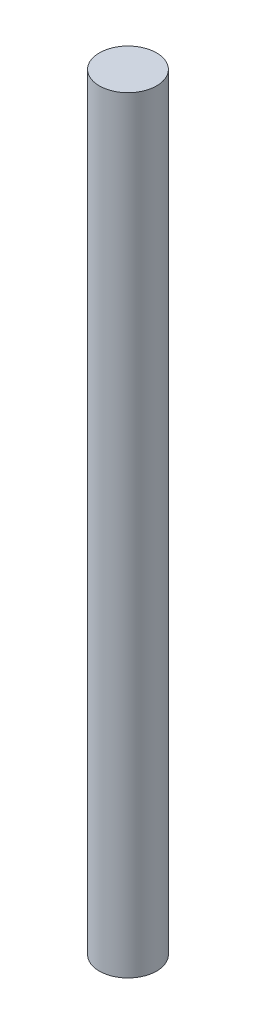
ISO-10303-21;
HEADER;
FILE_DESCRIPTION(('STEP AP214'),'2;1');
FILE_NAME('part.step','',(''),(''),'','','');
FILE_SCHEMA(('AUTOMOTIVE_DESIGN { 1 0 10303 214 1 1 1 1 }'));
ENDSEC;
DATA;
#1=APPLICATION_CONTEXT('core data for automotive mechanical design processes');
#2=APPLICATION_PROTOCOL_DEFINITION('international standard','automotive_design',2000,#1);
#3=PRODUCT_CONTEXT('',#1,'mechanical');
#4=PRODUCT('Part','Part','',(#3));
#5=PRODUCT_RELATED_PRODUCT_CATEGORY('part','',(#4));
#6=PRODUCT_DEFINITION_FORMATION('','',#4);
#7=PRODUCT_DEFINITION_CONTEXT('part definition',#1,'design');
#8=PRODUCT_DEFINITION('design','',#6,#7);
#9=PRODUCT_DEFINITION_SHAPE('','',#8);
#10=(LENGTH_UNIT() NAMED_UNIT(*) SI_UNIT(.MILLI.,.METRE.));
#11=(NAMED_UNIT(*) PLANE_ANGLE_UNIT() SI_UNIT($,.RADIAN.));
#12=(NAMED_UNIT(*) SI_UNIT($,.STERADIAN.) SOLID_ANGLE_UNIT());
#13=UNCERTAINTY_MEASURE_WITH_UNIT(LENGTH_MEASURE(1.E-05),#10,'distance_accuracy_value','');
#14=(GEOMETRIC_REPRESENTATION_CONTEXT(3) GLOBAL_UNCERTAINTY_ASSIGNED_CONTEXT((#13)) GLOBAL_UNIT_ASSIGNED_CONTEXT((#10,
#11,#12)) REPRESENTATION_CONTEXT('',''));
#15=CARTESIAN_POINT('',(0.,0.,0.));
#16=DIRECTION('',(0.,0.,1.));
#17=DIRECTION('',(1.,0.,0.));
#18=AXIS2_PLACEMENT_3D('',#15,#16,#17);
#19=CARTESIAN_POINT('',(0.,51.054,0.));
#20=DIRECTION('',(0.,-1.,0.));
#21=DIRECTION('',(0.,0.,-1.));
#22=AXIS2_PLACEMENT_3D('',#19,#20,#21);
#23=CYLINDRICAL_SURFACE('',#22,1.905);
#24=CARTESIAN_POINT('',(0.,51.054,0.));
#25=DIRECTION('',(0.,1.,0.));
#26=DIRECTION('',(0.,0.,1.));
#27=AXIS2_PLACEMENT_3D('',#24,#25,#26);
#28=CIRCLE('',#27,1.905);
#29=CARTESIAN_POINT('',(0.,51.054,1.905));
#30=VERTEX_POINT('',#29);
#31=EDGE_CURVE('E10',#30,#30,#28,.T.);
#32=ORIENTED_EDGE('',*,*,#31,.F.);
#33=EDGE_LOOP('',(#32));
#34=FACE_BOUND('',#33,.T.);
#35=CARTESIAN_POINT('',(0.,0.,0.));
#36=DIRECTION('',(0.,1.,0.));
#37=DIRECTION('',(0.,0.,1.));
#38=AXIS2_PLACEMENT_3D('',#35,#36,#37);
#39=CIRCLE('',#38,1.905);
#40=CARTESIAN_POINT('',(0.,0.,1.905));
#41=VERTEX_POINT('',#40);
#42=EDGE_CURVE('E42',#41,#41,#39,.T.);
#43=ORIENTED_EDGE('',*,*,#42,.T.);
#44=EDGE_LOOP('',(#43));
#45=FACE_BOUND('',#44,.T.);
#46=ADVANCED_FACE('F39',(#34,#45),#23,.T.);
#47=CARTESIAN_POINT('',(0.,51.054,0.));
#48=DIRECTION('',(0.,1.,0.));
#49=DIRECTION('',(0.,0.,1.));
#50=AXIS2_PLACEMENT_3D('',#47,#48,#49);
#51=PLANE('',#50);
#52=ORIENTED_EDGE('',*,*,#31,.T.);
#53=EDGE_LOOP('',(#52));
#54=FACE_BOUND('',#53,.T.);
#55=ADVANCED_FACE('F54',(#54),#51,.T.);
#56=CARTESIAN_POINT('',(0.,0.,0.));
#57=DIRECTION('',(0.,1.,0.));
#58=DIRECTION('',(0.,0.,1.));
#59=AXIS2_PLACEMENT_3D('',#56,#57,#58);
#60=PLANE('',#59);
#61=ORIENTED_EDGE('',*,*,#42,.F.);
#62=EDGE_LOOP('',(#61));
#63=FACE_BOUND('',#62,.T.);
#64=ADVANCED_FACE('F52',(#63),#60,.F.);
#65=CLOSED_SHELL('',(#46,#55,#64));
#66=MANIFOLD_SOLID_BREP('B2',#65);
#67=ADVANCED_BREP_SHAPE_REPRESENTATION('',(#18,#66),#14);
#68=SHAPE_DEFINITION_REPRESENTATION(#9,#67);
ENDSEC;
END-ISO-10303-21;
